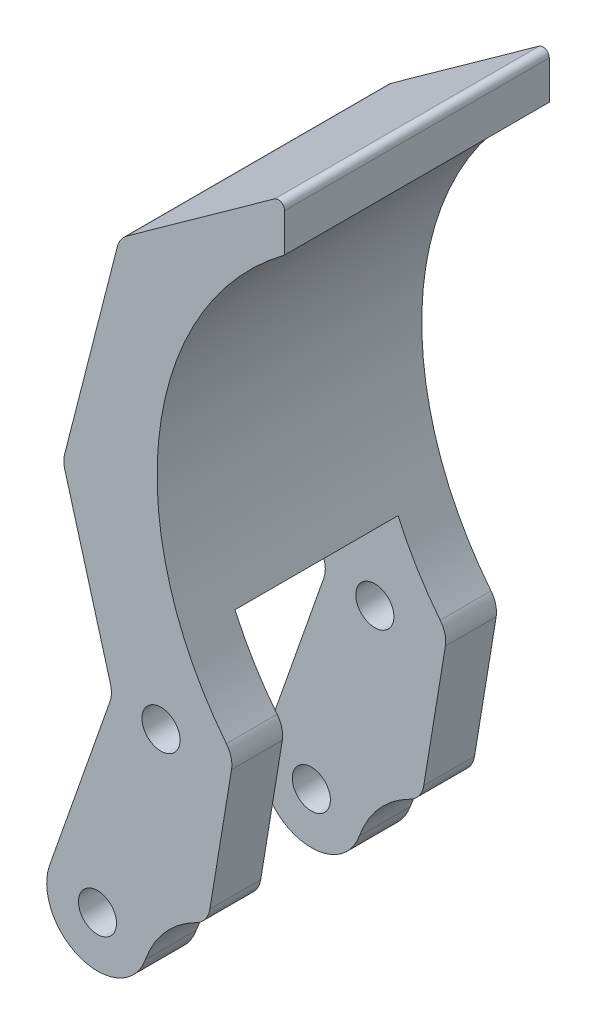
ISO-10303-21;
HEADER;
FILE_DESCRIPTION(('STEP AP214'),'2;1');
FILE_NAME('part.step','',(''),(''),'','','');
FILE_SCHEMA(('AUTOMOTIVE_DESIGN { 1 0 10303 214 1 1 1 1 }'));
ENDSEC;
DATA;
#1=APPLICATION_CONTEXT('core data for automotive mechanical design processes');
#2=APPLICATION_PROTOCOL_DEFINITION('international standard','automotive_design',2000,#1);
#3=PRODUCT_CONTEXT('',#1,'mechanical');
#4=PRODUCT('Part','Part','',(#3));
#5=PRODUCT_RELATED_PRODUCT_CATEGORY('part','',(#4));
#6=PRODUCT_DEFINITION_FORMATION('','',#4);
#7=PRODUCT_DEFINITION_CONTEXT('part definition',#1,'design');
#8=PRODUCT_DEFINITION('design','',#6,#7);
#9=PRODUCT_DEFINITION_SHAPE('','',#8);
#10=(LENGTH_UNIT() NAMED_UNIT(*) SI_UNIT(.MILLI.,.METRE.));
#11=(NAMED_UNIT(*) PLANE_ANGLE_UNIT() SI_UNIT($,.RADIAN.));
#12=(NAMED_UNIT(*) SI_UNIT($,.STERADIAN.) SOLID_ANGLE_UNIT());
#13=UNCERTAINTY_MEASURE_WITH_UNIT(LENGTH_MEASURE(1.E-05),#10,'distance_accuracy_value','');
#14=(GEOMETRIC_REPRESENTATION_CONTEXT(3) GLOBAL_UNCERTAINTY_ASSIGNED_CONTEXT((#13)) GLOBAL_UNIT_ASSIGNED_CONTEXT((#10,
#11,#12)) REPRESENTATION_CONTEXT('',''));
#15=CARTESIAN_POINT('',(0.,0.,0.));
#16=DIRECTION('',(0.,0.,1.));
#17=DIRECTION('',(1.,0.,0.));
#18=AXIS2_PLACEMENT_3D('',#15,#16,#17);
#19=CARTESIAN_POINT('',(-26.7730991458901,38.7518293933664,20.84));
#20=DIRECTION('',(-0.269912854825617,0.962884754682452,0.));
#21=DIRECTION('',(-0.962884754682452,-0.269912854825617,0.));
#22=AXIS2_PLACEMENT_3D('',#19,#20,#21);
#23=PLANE('',#22);
#24=DIRECTION('',(-0.962884754682452,-0.269912854825617,0.));
#25=VECTOR('',#24,1.);
#26=CARTESIAN_POINT('',(-19.8345750781231,40.6968148449482,16.84));
#27=LINE('',#26,#25);
#28=CARTESIAN_POINT('',(-19.8345750781231,40.6968148449482,16.84));
#29=VERTEX_POINT('',#28);
#30=CARTESIAN_POINT('',(-26.7730991458901,38.7518293933664,16.84));
#31=VERTEX_POINT('',#30);
#32=EDGE_CURVE('E211',#29,#31,#27,.T.);
#33=ORIENTED_EDGE('',*,*,#32,.T.);
#34=DIRECTION('',(0.,0.,-1.));
#35=VECTOR('',#34,1.);
#36=CARTESIAN_POINT('',(-26.7730991458901,38.7518293933664,20.84));
#37=LINE('',#36,#35);
#38=CARTESIAN_POINT('',(-26.7730991458901,38.7518293933664,4.));
#39=VERTEX_POINT('',#38);
#40=EDGE_CURVE('E64',#31,#39,#37,.T.);
#41=ORIENTED_EDGE('',*,*,#40,.T.);
#42=DIRECTION('',(0.962884754682452,0.269912854825617,0.));
#43=VECTOR('',#42,1.);
#44=CARTESIAN_POINT('',(3.99148156645819,47.3756608199233,4.));
#45=LINE('',#44,#43);
#46=CARTESIAN_POINT('',(-19.8345750781231,40.6968148449482,4.));
#47=VERTEX_POINT('',#46);
#48=EDGE_CURVE('E224',#39,#47,#45,.T.);
#49=ORIENTED_EDGE('',*,*,#48,.T.);
#50=DIRECTION('',(0.,0.,-1.));
#51=VECTOR('',#50,1.);
#52=CARTESIAN_POINT('',(-19.8345750781231,40.6968148449482,20.84));
#53=LINE('',#52,#51);
#54=EDGE_CURVE('E56',#29,#47,#53,.T.);
#55=ORIENTED_EDGE('',*,*,#54,.F.);
#56=EDGE_LOOP('',(#33,#41,#49,#55));
#57=FACE_BOUND('',#56,.T.);
#58=ADVANCED_FACE('F39',(#57),#23,.F.);
#59=CARTESIAN_POINT('',(3.02913563456561,50.8087252701093,4.));
#60=DIRECTION('',(0.,0.,-1.));
#61=DIRECTION('',(-1.,0.,0.));
#62=AXIS2_PLACEMENT_3D('',#59,#60,#61);
#63=PLANE('',#62);
#64=CARTESIAN_POINT('',(-21.6661944751087,33.6343221426984,4.));
#65=DIRECTION('',(0.,0.,1.));
#66=DIRECTION('',(1.,0.,0.));
#67=AXIS2_PLACEMENT_3D('',#64,#65,#66);
#68=CIRCLE('',#67,1.5);
#69=CARTESIAN_POINT('',(-20.1661944751087,33.6343221426984,4.));
#70=VERTEX_POINT('',#69);
#71=EDGE_CURVE('E235',#70,#70,#68,.T.);
#72=ORIENTED_EDGE('',*,*,#71,.F.);
#73=EDGE_LOOP('',(#72));
#74=FACE_BOUND('',#73,.T.);
#75=CARTESIAN_POINT('',(-26.6661944751087,18.6343221426984,4.));
#76=DIRECTION('',(0.,0.,1.));
#77=DIRECTION('',(-1.,0.,0.));
#78=AXIS2_PLACEMENT_3D('',#75,#76,#77);
#79=CIRCLE('',#78,1.5);
#80=CARTESIAN_POINT('',(-28.1661944751087,18.6343221426984,4.));
#81=VERTEX_POINT('',#80);
#82=EDGE_CURVE('E241',#81,#81,#79,.T.);
#83=ORIENTED_EDGE('',*,*,#82,.F.);
#84=EDGE_LOOP('',(#83));
#85=FACE_BOUND('',#84,.T.);
#86=ORIENTED_EDGE('',*,*,#48,.F.);
#87=DIRECTION('',(0.269912854825616,-0.962884754682452,0.));
#88=VECTOR('',#87,1.);
#89=CARTESIAN_POINT('',(-25.6428361003143,34.7197389022744,4.));
#90=LINE('',#89,#88);
#91=CARTESIAN_POINT('',(-25.6428361003143,34.7197389022744,4.));
#92=VERTEX_POINT('',#91);
#93=EDGE_CURVE('E249',#39,#92,#90,.T.);
#94=ORIENTED_EDGE('',*,*,#93,.T.);
#95=CARTESIAN_POINT('',(-27.5686056096793,34.1799131926231,4.));
#96=DIRECTION('',(0.,0.,-1.));
#97=DIRECTION('',(1.,0.,0.));
#98=AXIS2_PLACEMENT_3D('',#95,#96,#97);
#99=CIRCLE('',#98,2.);
#100=CARTESIAN_POINT('',(-25.6814762724612,33.5175365138287,4.));
#101=VERTEX_POINT('',#100);
#102=EDGE_CURVE('E252',#92,#101,#99,.T.);
#103=ORIENTED_EDGE('',*,*,#102,.T.);
#104=DIRECTION('',(-0.331188339397233,-0.943564668609048,0.));
#105=VECTOR('',#104,1.);
#106=CARTESIAN_POINT('',(-30.4404547988141,19.9590760791758,4.));
#107=LINE('',#106,#105);
#108=CARTESIAN_POINT('',(-30.4404547988141,19.9590760791758,4.));
#109=VERTEX_POINT('',#108);
#110=EDGE_CURVE('E254',#101,#109,#107,.T.);
#111=ORIENTED_EDGE('',*,*,#110,.T.);
#112=CARTESIAN_POINT('',(-26.6661944751087,18.6343221426984,4.));
#113=DIRECTION('',(0.,0.,1.));
#114=DIRECTION('',(1.,0.,0.));
#115=AXIS2_PLACEMENT_3D('',#112,#113,#114);
#116=CIRCLE('',#115,4.00000174791326);
#117=CARTESIAN_POINT('',(-22.8919341514033,17.309568206221,4.));
#118=VERTEX_POINT('',#117);
#119=EDGE_CURVE('E256',#109,#118,#116,.T.);
#120=ORIENTED_EDGE('',*,*,#119,.T.);
#121=CARTESIAN_POINT('',(-15.3434168025309,14.6600614910431,4.));
#122=DIRECTION('',(0.,0.,-1.));
#123=DIRECTION('',(-1.,0.,0.));
#124=AXIS2_PLACEMENT_3D('',#121,#122,#123);
#125=CIRCLE('',#124,8.);
#126=CARTESIAN_POINT('',(-18.8990856555673,21.8264566104561,4.));
#127=VERTEX_POINT('',#126);
#128=EDGE_CURVE('E258',#118,#127,#125,.T.);
#129=ORIENTED_EDGE('',*,*,#128,.T.);
#130=CARTESIAN_POINT('',(-19.7880028688264,23.6180553903094,4.));
#131=DIRECTION('',(0.,0.,1.));
#132=DIRECTION('',(1.,0.,0.));
#133=AXIS2_PLACEMENT_3D('',#130,#131,#132);
#134=CIRCLE('',#133,2.);
#135=CARTESIAN_POINT('',(-17.8145227633955,23.2934382720478,4.));
#136=VERTEX_POINT('',#135);
#137=EDGE_CURVE('E260',#127,#136,#134,.T.);
#138=ORIENTED_EDGE('',*,*,#137,.T.);
#139=DIRECTION('',(0.162308559130773,0.986740052715452,0.));
#140=VECTOR('',#139,1.);
#141=CARTESIAN_POINT('',(-16.1102828925224,33.65420882556,4.));
#142=LINE('',#141,#140);
#143=CARTESIAN_POINT('',(-16.1102828925224,33.65420882556,4.));
#144=VERTEX_POINT('',#143);
#145=EDGE_CURVE('E262',#136,#144,#142,.T.);
#146=ORIENTED_EDGE('',*,*,#145,.T.);
#147=CARTESIAN_POINT('',(-18.0837629979533,33.9788259438216,4.));
#148=DIRECTION('',(0.,0.,1.));
#149=DIRECTION('',(1.,0.,0.));
#150=AXIS2_PLACEMENT_3D('',#147,#148,#149);
#151=CIRCLE('',#150,2.);
#152=CARTESIAN_POINT('',(-16.5198445807297,35.2254851531762,4.));
#153=VERTEX_POINT('',#152);
#154=EDGE_CURVE('E264',#144,#153,#151,.T.);
#155=ORIENTED_EDGE('',*,*,#154,.T.);
#156=CARTESIAN_POINT('',(3.02913563456561,50.8087252701093,4.));
#157=DIRECTION('',(0.,0.,-1.));
#158=DIRECTION('',(-1.,0.,0.));
#159=AXIS2_PLACEMENT_3D('',#156,#157,#158);
#160=CIRCLE('',#159,25.);
#161=EDGE_CURVE('E247',#153,#47,#160,.T.);
#162=ORIENTED_EDGE('',*,*,#161,.T.);
#163=EDGE_LOOP('',(#86,#94,#103,#111,#120,#129,#138,#146,#155,#162));
#164=FACE_BOUND('',#163,.T.);
#165=ADVANCED_FACE('F454',(#74,#85,#164),#63,.F.);
#166=CARTESIAN_POINT('',(3.02913563456561,50.8087252701093,0.));
#167=DIRECTION('',(0.,0.,-1.));
#168=DIRECTION('',(-1.,0.,0.));
#169=AXIS2_PLACEMENT_3D('',#166,#167,#168);
#170=PLANE('',#169);
#171=DIRECTION('',(0.,1.,0.));
#172=VECTOR('',#171,1.);
#173=CARTESIAN_POINT('',(-11.927927268659,73.8667263637474,0.));
#174=LINE('',#173,#172);
#175=CARTESIAN_POINT('',(-11.927927268659,70.8408561929288,0.));
#176=VERTEX_POINT('',#175);
#177=CARTESIAN_POINT('',(-11.927927268659,73.8667263637474,0.));
#178=VERTEX_POINT('',#177);
#179=EDGE_CURVE('E268',#176,#178,#174,.T.);
#180=ORIENTED_EDGE('',*,*,#179,.F.);
#181=CARTESIAN_POINT('',(3.02913563456561,50.8087252701093,0.));
#182=DIRECTION('',(0.,0.,-1.));
#183=DIRECTION('',(-1.,0.,0.));
#184=AXIS2_PLACEMENT_3D('',#181,#182,#183);
#185=CIRCLE('',#184,25.);
#186=CARTESIAN_POINT('',(-16.5198445807297,35.2254851531762,0.));
#187=VERTEX_POINT('',#186);
#188=EDGE_CURVE('E244',#187,#176,#185,.T.);
#189=ORIENTED_EDGE('',*,*,#188,.F.);
#190=CARTESIAN_POINT('',(-18.0837629979533,33.9788259438216,0.));
#191=DIRECTION('',(0.,0.,1.));
#192=DIRECTION('',(1.,0.,0.));
#193=AXIS2_PLACEMENT_3D('',#190,#191,#192);
#194=CIRCLE('',#193,2.);
#195=CARTESIAN_POINT('',(-16.1102828925224,33.65420882556,0.));
#196=VERTEX_POINT('',#195);
#197=EDGE_CURVE('E250',#196,#187,#194,.T.);
#198=ORIENTED_EDGE('',*,*,#197,.F.);
#199=DIRECTION('',(0.162308559130773,0.986740052715452,0.));
#200=VECTOR('',#199,1.);
#201=CARTESIAN_POINT('',(-16.1102828925224,33.65420882556,0.));
#202=LINE('',#201,#200);
#203=CARTESIAN_POINT('',(-17.8145227633955,23.2934382720478,0.));
#204=VERTEX_POINT('',#203);
#205=EDGE_CURVE('E292',#204,#196,#202,.T.);
#206=ORIENTED_EDGE('',*,*,#205,.F.);
#207=CARTESIAN_POINT('',(-19.7880028688264,23.6180553903094,0.));
#208=DIRECTION('',(0.,0.,1.));
#209=DIRECTION('',(1.,0.,0.));
#210=AXIS2_PLACEMENT_3D('',#207,#208,#209);
#211=CIRCLE('',#210,2.);
#212=CARTESIAN_POINT('',(-18.8990856555673,21.8264566104561,0.));
#213=VERTEX_POINT('',#212);
#214=EDGE_CURVE('E290',#213,#204,#211,.T.);
#215=ORIENTED_EDGE('',*,*,#214,.F.);
#216=CARTESIAN_POINT('',(-15.3434168025309,14.6600614910431,0.));
#217=DIRECTION('',(0.,0.,-1.));
#218=DIRECTION('',(-1.,0.,0.));
#219=AXIS2_PLACEMENT_3D('',#216,#217,#218);
#220=CIRCLE('',#219,8.);
#221=CARTESIAN_POINT('',(-22.8919341514033,17.309568206221,0.));
#222=VERTEX_POINT('',#221);
#223=EDGE_CURVE('E288',#222,#213,#220,.T.);
#224=ORIENTED_EDGE('',*,*,#223,.F.);
#225=CARTESIAN_POINT('',(-26.6661944751087,18.6343221426984,0.));
#226=DIRECTION('',(0.,0.,1.));
#227=DIRECTION('',(1.,0.,0.));
#228=AXIS2_PLACEMENT_3D('',#225,#226,#227);
#229=CIRCLE('',#228,4.00000174791326);
#230=CARTESIAN_POINT('',(-30.4404547988141,19.9590760791758,0.));
#231=VERTEX_POINT('',#230);
#232=EDGE_CURVE('E286',#231,#222,#229,.T.);
#233=ORIENTED_EDGE('',*,*,#232,.F.);
#234=DIRECTION('',(-0.331188339397233,-0.943564668609048,0.));
#235=VECTOR('',#234,1.);
#236=CARTESIAN_POINT('',(-30.4404547988141,19.9590760791758,0.));
#237=LINE('',#236,#235);
#238=CARTESIAN_POINT('',(-25.6814762724612,33.5175365138287,0.));
#239=VERTEX_POINT('',#238);
#240=EDGE_CURVE('E284',#239,#231,#237,.T.);
#241=ORIENTED_EDGE('',*,*,#240,.F.);
#242=CARTESIAN_POINT('',(-27.5686056096793,34.1799131926231,0.));
#243=DIRECTION('',(0.,0.,-1.));
#244=DIRECTION('',(1.,0.,0.));
#245=AXIS2_PLACEMENT_3D('',#242,#243,#244);
#246=CIRCLE('',#245,2.);
#247=CARTESIAN_POINT('',(-25.6428361003143,34.7197389022744,0.));
#248=VERTEX_POINT('',#247);
#249=EDGE_CURVE('E282',#248,#239,#246,.T.);
#250=ORIENTED_EDGE('',*,*,#249,.F.);
#251=DIRECTION('',(0.269912854825616,-0.962884754682452,0.));
#252=VECTOR('',#251,1.);
#253=CARTESIAN_POINT('',(-25.6428361003143,34.7197389022744,0.));
#254=LINE('',#253,#252);
#255=CARTESIAN_POINT('',(-29.2417202398724,47.5583666663643,0.));
#256=VERTEX_POINT('',#255);
#257=EDGE_CURVE('E280',#256,#248,#254,.T.);
#258=ORIENTED_EDGE('',*,*,#257,.F.);
#259=CARTESIAN_POINT('',(-27.3159507305075,48.0981923760155,0.));
#260=DIRECTION('',(0.,0.,1.));
#261=DIRECTION('',(-1.,0.,0.));
#262=AXIS2_PLACEMENT_3D('',#259,#260,#261);
#263=CIRCLE('',#262,2.);
#264=CARTESIAN_POINT('',(-29.2536289022766,48.5935743525241,0.));
#265=VERTEX_POINT('',#264);
#266=EDGE_CURVE('E278',#265,#256,#263,.T.);
#267=ORIENTED_EDGE('',*,*,#266,.F.);
#268=DIRECTION('',(-0.247690988254264,-0.968839085884558,0.));
#269=VECTOR('',#268,1.);
#270=CARTESIAN_POINT('',(-29.2536289022766,48.5935743525241,0.));
#271=LINE('',#270,#269);
#272=CARTESIAN_POINT('',(-25.1082326082913,64.8082214190178,0.));
#273=VERTEX_POINT('',#272);
#274=EDGE_CURVE('E276',#273,#265,#271,.T.);
#275=ORIENTED_EDGE('',*,*,#274,.F.);
#276=CARTESIAN_POINT('',(-23.1705544365222,64.3128394425093,0.));
#277=DIRECTION('',(0.,0.,1.));
#278=DIRECTION('',(-1.,0.,0.));
#279=AXIS2_PLACEMENT_3D('',#276,#277,#278);
#280=CIRCLE('',#279,2.);
#281=CARTESIAN_POINT('',(-24.3364766359972,65.9378395732082,0.));
#282=VERTEX_POINT('',#281);
#283=EDGE_CURVE('E274',#282,#273,#280,.T.);
#284=ORIENTED_EDGE('',*,*,#283,.F.);
#285=DIRECTION('',(-0.812500065349455,-0.58296109973748,0.));
#286=VECTOR('',#285,1.);
#287=CARTESIAN_POINT('',(-24.3364766359972,65.9378395732082,0.));
#288=LINE('',#287,#286);
#289=CARTESIAN_POINT('',(-12.7194078185277,74.2729763964221,0.));
#290=VERTEX_POINT('',#289);
#291=EDGE_CURVE('E272',#290,#282,#288,.T.);
#292=ORIENTED_EDGE('',*,*,#291,.F.);
#293=CARTESIAN_POINT('',(-12.427927268659,73.8667263637474,0.));
#294=DIRECTION('',(0.,0.,1.));
#295=DIRECTION('',(-1.,0.,0.));
#296=AXIS2_PLACEMENT_3D('',#293,#294,#295);
#297=CIRCLE('',#296,0.499999999999995);
#298=EDGE_CURVE('E270',#178,#290,#297,.T.);
#299=ORIENTED_EDGE('',*,*,#298,.F.);
#300=EDGE_LOOP('',(#180,#189,#198,#206,#215,#224,#233,#241,#250,#258,#267,#275,#284,#292,#299));
#301=FACE_BOUND('',#300,.T.);
#302=CARTESIAN_POINT('',(-26.6661944751087,18.6343221426984,0.));
#303=DIRECTION('',(0.,0.,1.));
#304=DIRECTION('',(-1.,0.,0.));
#305=AXIS2_PLACEMENT_3D('',#302,#303,#304);
#306=CIRCLE('',#305,1.5);
#307=CARTESIAN_POINT('',(-28.1661944751087,18.6343221426984,0.));
#308=VERTEX_POINT('',#307);
#309=EDGE_CURVE('E238',#308,#308,#306,.T.);
#310=ORIENTED_EDGE('',*,*,#309,.T.);
#311=EDGE_LOOP('',(#310));
#312=FACE_BOUND('',#311,.T.);
#313=CARTESIAN_POINT('',(-21.6661944751087,33.6343221426984,0.));
#314=DIRECTION('',(0.,0.,1.));
#315=DIRECTION('',(1.,0.,0.));
#316=AXIS2_PLACEMENT_3D('',#313,#314,#315);
#317=CIRCLE('',#316,1.5);
#318=CARTESIAN_POINT('',(-20.1661944751087,33.6343221426984,0.));
#319=VERTEX_POINT('',#318);
#320=EDGE_CURVE('E234',#319,#319,#317,.T.);
#321=ORIENTED_EDGE('',*,*,#320,.T.);
#322=EDGE_LOOP('',(#321));
#323=FACE_BOUND('',#322,.T.);
#324=ADVANCED_FACE('F439',(#301,#312,#323),#170,.T.);
#325=CARTESIAN_POINT('',(3.02913563456561,50.8087252701093,4.));
#326=DIRECTION('',(0.,0.,-1.));
#327=DIRECTION('',(-1.,0.,0.));
#328=AXIS2_PLACEMENT_3D('',#325,#326,#327);
#329=CYLINDRICAL_SURFACE('',#328,25.);
#330=DIRECTION('',(0.,0.,-1.));
#331=VECTOR('',#330,1.);
#332=CARTESIAN_POINT('',(-11.927927268659,70.8408561929288,4.));
#333=LINE('',#332,#331);
#334=CARTESIAN_POINT('',(-11.927927268659,70.8408561929288,20.84));
#335=VERTEX_POINT('',#334);
#336=EDGE_CURVE('E11',#335,#176,#333,.T.);
#337=ORIENTED_EDGE('',*,*,#336,.F.);
#338=CARTESIAN_POINT('',(3.02913563456561,50.8087252701093,20.84));
#339=DIRECTION('',(0.,0.,-1.));
#340=DIRECTION('',(1.,0.,0.));
#341=AXIS2_PLACEMENT_3D('',#338,#339,#340);
#342=CIRCLE('',#341,25.);
#343=CARTESIAN_POINT('',(-16.5198445807297,35.2254851531762,20.84));
#344=VERTEX_POINT('',#343);
#345=EDGE_CURVE('E407',#344,#335,#342,.T.);
#346=ORIENTED_EDGE('',*,*,#345,.F.);
#347=DIRECTION('',(0.,0.,1.));
#348=VECTOR('',#347,1.);
#349=CARTESIAN_POINT('',(-16.5198445807297,35.2254851531762,16.84));
#350=LINE('',#349,#348);
#351=CARTESIAN_POINT('',(-16.5198445807297,35.2254851531762,16.84));
#352=VERTEX_POINT('',#351);
#353=EDGE_CURVE('E221',#352,#344,#350,.T.);
#354=ORIENTED_EDGE('',*,*,#353,.F.);
#355=CARTESIAN_POINT('',(3.02913563456561,50.8087252701093,16.84));
#356=DIRECTION('',(0.,0.,-1.));
#357=DIRECTION('',(1.,0.,0.));
#358=AXIS2_PLACEMENT_3D('',#355,#356,#357);
#359=CIRCLE('',#358,25.);
#360=EDGE_CURVE('E214',#352,#29,#359,.T.);
#361=ORIENTED_EDGE('',*,*,#360,.T.);
#362=ORIENTED_EDGE('',*,*,#54,.T.);
#363=ORIENTED_EDGE('',*,*,#161,.F.);
#364=DIRECTION('',(0.,0.,-1.));
#365=VECTOR('',#364,1.);
#366=CARTESIAN_POINT('',(-16.5198445807297,35.2254851531762,4.));
#367=LINE('',#366,#365);
#368=EDGE_CURVE('E266',#153,#187,#367,.T.);
#369=ORIENTED_EDGE('',*,*,#368,.T.);
#370=ORIENTED_EDGE('',*,*,#188,.T.);
#371=EDGE_LOOP('',(#337,#346,#354,#361,#362,#363,#369,#370));
#372=FACE_BOUND('',#371,.T.);
#373=ADVANCED_FACE('F41',(#372),#329,.F.);
#374=CARTESIAN_POINT('',(-11.927927268659,73.8667263637474,4.));
#375=DIRECTION('',(-1.,0.,0.));
#376=DIRECTION('',(0.,0.,1.));
#377=AXIS2_PLACEMENT_3D('',#374,#375,#376);
#378=PLANE('',#377);
#379=ORIENTED_EDGE('',*,*,#179,.T.);
#380=DIRECTION('',(0.,0.,-1.));
#381=VECTOR('',#380,1.);
#382=CARTESIAN_POINT('',(-11.927927268659,73.8667263637474,4.));
#383=LINE('',#382,#381);
#384=CARTESIAN_POINT('',(-11.927927268659,73.8667263637474,20.84));
#385=VERTEX_POINT('',#384);
#386=EDGE_CURVE('E48',#385,#178,#383,.T.);
#387=ORIENTED_EDGE('',*,*,#386,.F.);
#388=DIRECTION('',(0.,1.,0.));
#389=VECTOR('',#388,1.);
#390=CARTESIAN_POINT('',(-11.927927268659,70.8408561929288,20.84));
#391=LINE('',#390,#389);
#392=EDGE_CURVE('E410',#335,#385,#391,.T.);
#393=ORIENTED_EDGE('',*,*,#392,.F.);
#394=ORIENTED_EDGE('',*,*,#336,.T.);
#395=EDGE_LOOP('',(#379,#387,#393,#394));
#396=FACE_BOUND('',#395,.T.);
#397=ADVANCED_FACE('F486',(#396),#378,.F.);
#398=CARTESIAN_POINT('',(-12.427927268659,73.8667263637474,4.));
#399=DIRECTION('',(0.,0.,-1.));
#400=DIRECTION('',(-1.,0.,0.));
#401=AXIS2_PLACEMENT_3D('',#398,#399,#400);
#402=CYLINDRICAL_SURFACE('',#401,0.499999999999995);
#403=ORIENTED_EDGE('',*,*,#298,.T.);
#404=DIRECTION('',(0.,0.,-1.));
#405=VECTOR('',#404,1.);
#406=CARTESIAN_POINT('',(-12.7194078185277,74.2729763964221,4.));
#407=LINE('',#406,#405);
#408=CARTESIAN_POINT('',(-12.7194078185277,74.2729763964221,20.84));
#409=VERTEX_POINT('',#408);
#410=EDGE_CURVE('E330',#409,#290,#407,.T.);
#411=ORIENTED_EDGE('',*,*,#410,.F.);
#412=CARTESIAN_POINT('',(-12.427927268659,73.8667263637474,20.84));
#413=DIRECTION('',(0.,0.,1.));
#414=DIRECTION('',(1.,0.,0.));
#415=AXIS2_PLACEMENT_3D('',#412,#413,#414);
#416=CIRCLE('',#415,0.499999999999995);
#417=EDGE_CURVE('E413',#385,#409,#416,.T.);
#418=ORIENTED_EDGE('',*,*,#417,.F.);
#419=ORIENTED_EDGE('',*,*,#386,.T.);
#420=EDGE_LOOP('',(#403,#411,#418,#419));
#421=FACE_BOUND('',#420,.T.);
#422=ADVANCED_FACE('F489',(#421),#402,.T.);
#423=CARTESIAN_POINT('',(-24.3364766359972,65.9378395732082,4.));
#424=DIRECTION('',(0.58296109973748,-0.812500065349455,0.));
#425=DIRECTION('',(0.812500065349455,0.58296109973748,0.));
#426=AXIS2_PLACEMENT_3D('',#423,#424,#425);
#427=PLANE('',#426);
#428=ORIENTED_EDGE('',*,*,#291,.T.);
#429=DIRECTION('',(0.,0.,-1.));
#430=VECTOR('',#429,1.);
#431=CARTESIAN_POINT('',(-24.3364766359972,65.9378395732082,4.));
#432=LINE('',#431,#430);
#433=CARTESIAN_POINT('',(-24.3364766359972,65.9378395732082,20.84));
#434=VERTEX_POINT('',#433);
#435=EDGE_CURVE('E327',#434,#282,#432,.T.);
#436=ORIENTED_EDGE('',*,*,#435,.F.);
#437=DIRECTION('',(-0.812500065349455,-0.58296109973748,0.));
#438=VECTOR('',#437,1.);
#439=CARTESIAN_POINT('',(-12.7194078185277,74.2729763964221,20.84));
#440=LINE('',#439,#438);
#441=EDGE_CURVE('E416',#409,#434,#440,.T.);
#442=ORIENTED_EDGE('',*,*,#441,.F.);
#443=ORIENTED_EDGE('',*,*,#410,.T.);
#444=EDGE_LOOP('',(#428,#436,#442,#443));
#445=FACE_BOUND('',#444,.T.);
#446=ADVANCED_FACE('F494',(#445),#427,.F.);
#447=CARTESIAN_POINT('',(-23.1705544365222,64.3128394425093,4.));
#448=DIRECTION('',(0.,0.,-1.));
#449=DIRECTION('',(-1.,0.,0.));
#450=AXIS2_PLACEMENT_3D('',#447,#448,#449);
#451=CYLINDRICAL_SURFACE('',#450,2.);
#452=ORIENTED_EDGE('',*,*,#283,.T.);
#453=DIRECTION('',(0.,0.,-1.));
#454=VECTOR('',#453,1.);
#455=CARTESIAN_POINT('',(-25.1082326082913,64.8082214190178,4.));
#456=LINE('',#455,#454);
#457=CARTESIAN_POINT('',(-25.1082326082913,64.8082214190178,20.84));
#458=VERTEX_POINT('',#457);
#459=EDGE_CURVE('E324',#458,#273,#456,.T.);
#460=ORIENTED_EDGE('',*,*,#459,.F.);
#461=CARTESIAN_POINT('',(-23.1705544365222,64.3128394425093,20.84));
#462=DIRECTION('',(0.,0.,1.));
#463=DIRECTION('',(1.,0.,0.));
#464=AXIS2_PLACEMENT_3D('',#461,#462,#463);
#465=CIRCLE('',#464,2.);
#466=EDGE_CURVE('E419',#434,#458,#465,.T.);
#467=ORIENTED_EDGE('',*,*,#466,.F.);
#468=ORIENTED_EDGE('',*,*,#435,.T.);
#469=EDGE_LOOP('',(#452,#460,#467,#468));
#470=FACE_BOUND('',#469,.T.);
#471=ADVANCED_FACE('F497',(#470),#451,.T.);
#472=CARTESIAN_POINT('',(-29.2536289022766,48.5935743525241,4.));
#473=DIRECTION('',(0.968839085884558,-0.247690988254264,0.));
#474=DIRECTION('',(0.247690988254264,0.968839085884558,0.));
#475=AXIS2_PLACEMENT_3D('',#472,#473,#474);
#476=PLANE('',#475);
#477=ORIENTED_EDGE('',*,*,#274,.T.);
#478=DIRECTION('',(0.,0.,-1.));
#479=VECTOR('',#478,1.);
#480=CARTESIAN_POINT('',(-29.2536289022766,48.5935743525241,4.));
#481=LINE('',#480,#479);
#482=CARTESIAN_POINT('',(-29.2536289022766,48.5935743525241,20.84));
#483=VERTEX_POINT('',#482);
#484=EDGE_CURVE('E321',#483,#265,#481,.T.);
#485=ORIENTED_EDGE('',*,*,#484,.F.);
#486=DIRECTION('',(-0.247690988254264,-0.968839085884558,0.));
#487=VECTOR('',#486,1.);
#488=CARTESIAN_POINT('',(-25.1082326082913,64.8082214190178,20.84));
#489=LINE('',#488,#487);
#490=EDGE_CURVE('E229',#458,#483,#489,.T.);
#491=ORIENTED_EDGE('',*,*,#490,.F.);
#492=ORIENTED_EDGE('',*,*,#459,.T.);
#493=EDGE_LOOP('',(#477,#485,#491,#492));
#494=FACE_BOUND('',#493,.T.);
#495=ADVANCED_FACE('F498',(#494),#476,.F.);
#496=CARTESIAN_POINT('',(-27.3159507305075,48.0981923760155,4.));
#497=DIRECTION('',(0.,0.,-1.));
#498=DIRECTION('',(-1.,0.,0.));
#499=AXIS2_PLACEMENT_3D('',#496,#497,#498);
#500=CYLINDRICAL_SURFACE('',#499,2.);
#501=ORIENTED_EDGE('',*,*,#266,.T.);
#502=DIRECTION('',(0.,0.,-1.));
#503=VECTOR('',#502,1.);
#504=CARTESIAN_POINT('',(-29.2417202398724,47.5583666663643,4.));
#505=LINE('',#504,#503);
#506=CARTESIAN_POINT('',(-29.2417202398724,47.5583666663643,20.84));
#507=VERTEX_POINT('',#506);
#508=EDGE_CURVE('E318',#507,#256,#505,.T.);
#509=ORIENTED_EDGE('',*,*,#508,.F.);
#510=CARTESIAN_POINT('',(-27.3159507305075,48.0981923760155,20.84));
#511=DIRECTION('',(0.,0.,1.));
#512=DIRECTION('',(1.,0.,0.));
#513=AXIS2_PLACEMENT_3D('',#510,#511,#512);
#514=CIRCLE('',#513,2.);
#515=EDGE_CURVE('E225',#483,#507,#514,.T.);
#516=ORIENTED_EDGE('',*,*,#515,.F.);
#517=ORIENTED_EDGE('',*,*,#484,.T.);
#518=EDGE_LOOP('',(#501,#509,#516,#517));
#519=FACE_BOUND('',#518,.T.);
#520=ADVANCED_FACE('F430',(#519),#500,.T.);
#521=CARTESIAN_POINT('',(-25.6428361003143,34.7197389022744,4.));
#522=DIRECTION('',(0.962884754682452,0.269912854825616,0.));
#523=DIRECTION('',(-0.269912854825616,0.962884754682452,0.));
#524=AXIS2_PLACEMENT_3D('',#521,#522,#523);
#525=PLANE('',#524);
#526=ORIENTED_EDGE('',*,*,#257,.T.);
#527=DIRECTION('',(0.,0.,-1.));
#528=VECTOR('',#527,1.);
#529=CARTESIAN_POINT('',(-25.6428361003143,34.7197389022744,4.));
#530=LINE('',#529,#528);
#531=EDGE_CURVE('E315',#92,#248,#530,.T.);
#532=ORIENTED_EDGE('',*,*,#531,.F.);
#533=ORIENTED_EDGE('',*,*,#93,.F.);
#534=ORIENTED_EDGE('',*,*,#40,.F.);
#535=DIRECTION('',(0.269912854825616,-0.962884754682452,0.));
#536=VECTOR('',#535,1.);
#537=CARTESIAN_POINT('',(-26.7730991458901,38.7518293933664,16.84));
#538=LINE('',#537,#536);
#539=CARTESIAN_POINT('',(-25.6428361003143,34.7197389022744,16.84));
#540=VERTEX_POINT('',#539);
#541=EDGE_CURVE('E218',#31,#540,#538,.T.);
#542=ORIENTED_EDGE('',*,*,#541,.T.);
#543=DIRECTION('',(0.,0.,1.));
#544=VECTOR('',#543,1.);
#545=CARTESIAN_POINT('',(-25.6428361003143,34.7197389022744,16.84));
#546=LINE('',#545,#544);
#547=CARTESIAN_POINT('',(-25.6428361003143,34.7197389022744,20.84));
#548=VERTEX_POINT('',#547);
#549=EDGE_CURVE('E370',#540,#548,#546,.T.);
#550=ORIENTED_EDGE('',*,*,#549,.T.);
#551=DIRECTION('',(0.269912854825616,-0.962884754682452,0.));
#552=VECTOR('',#551,1.);
#553=CARTESIAN_POINT('',(-29.2417202398724,47.5583666663643,20.84));
#554=LINE('',#553,#552);
#555=EDGE_CURVE('E391',#507,#548,#554,.T.);
#556=ORIENTED_EDGE('',*,*,#555,.F.);
#557=ORIENTED_EDGE('',*,*,#508,.T.);
#558=EDGE_LOOP('',(#526,#532,#533,#534,#542,#550,#556,#557));
#559=FACE_BOUND('',#558,.T.);
#560=ADVANCED_FACE('F434',(#559),#525,.F.);
#561=CARTESIAN_POINT('',(-27.5686056096793,34.1799131926231,4.));
#562=DIRECTION('',(0.,0.,-1.));
#563=DIRECTION('',(-1.,0.,0.));
#564=AXIS2_PLACEMENT_3D('',#561,#562,#563);
#565=CYLINDRICAL_SURFACE('',#564,2.);
#566=ORIENTED_EDGE('',*,*,#249,.T.);
#567=DIRECTION('',(0.,0.,-1.));
#568=VECTOR('',#567,1.);
#569=CARTESIAN_POINT('',(-25.6814762724612,33.5175365138287,4.));
#570=LINE('',#569,#568);
#571=EDGE_CURVE('E312',#101,#239,#570,.T.);
#572=ORIENTED_EDGE('',*,*,#571,.F.);
#573=ORIENTED_EDGE('',*,*,#102,.F.);
#574=ORIENTED_EDGE('',*,*,#531,.T.);
#575=EDGE_LOOP('',(#566,#572,#573,#574));
#576=FACE_BOUND('',#575,.T.);
#577=ADVANCED_FACE('F446',(#576),#565,.F.);
#578=CARTESIAN_POINT('',(-30.4404547988141,19.9590760791758,4.));
#579=DIRECTION('',(0.943564668609048,-0.331188339397233,0.));
#580=DIRECTION('',(0.331188339397233,0.943564668609048,0.));
#581=AXIS2_PLACEMENT_3D('',#578,#579,#580);
#582=PLANE('',#581);
#583=ORIENTED_EDGE('',*,*,#240,.T.);
#584=DIRECTION('',(0.,0.,-1.));
#585=VECTOR('',#584,1.);
#586=CARTESIAN_POINT('',(-30.4404547988141,19.9590760791758,4.));
#587=LINE('',#586,#585);
#588=EDGE_CURVE('E309',#109,#231,#587,.T.);
#589=ORIENTED_EDGE('',*,*,#588,.F.);
#590=ORIENTED_EDGE('',*,*,#110,.F.);
#591=ORIENTED_EDGE('',*,*,#571,.T.);
#592=EDGE_LOOP('',(#583,#589,#590,#591));
#593=FACE_BOUND('',#592,.T.);
#594=ADVANCED_FACE('F450',(#593),#582,.F.);
#595=CARTESIAN_POINT('',(-26.6661944751087,18.6343221426984,4.));
#596=DIRECTION('',(0.,0.,-1.));
#597=DIRECTION('',(-1.,0.,0.));
#598=AXIS2_PLACEMENT_3D('',#595,#596,#597);
#599=CYLINDRICAL_SURFACE('',#598,4.00000174791326);
#600=ORIENTED_EDGE('',*,*,#232,.T.);
#601=DIRECTION('',(0.,0.,-1.));
#602=VECTOR('',#601,1.);
#603=CARTESIAN_POINT('',(-22.8919341514033,17.309568206221,4.));
#604=LINE('',#603,#602);
#605=EDGE_CURVE('E306',#118,#222,#604,.T.);
#606=ORIENTED_EDGE('',*,*,#605,.F.);
#607=ORIENTED_EDGE('',*,*,#119,.F.);
#608=ORIENTED_EDGE('',*,*,#588,.T.);
#609=EDGE_LOOP('',(#600,#606,#607,#608));
#610=FACE_BOUND('',#609,.T.);
#611=ADVANCED_FACE('F542',(#610),#599,.T.);
#612=CARTESIAN_POINT('',(-15.3434168025309,14.6600614910431,4.));
#613=DIRECTION('',(0.,0.,-1.));
#614=DIRECTION('',(-1.,0.,0.));
#615=AXIS2_PLACEMENT_3D('',#612,#613,#614);
#616=CYLINDRICAL_SURFACE('',#615,8.);
#617=ORIENTED_EDGE('',*,*,#223,.T.);
#618=DIRECTION('',(0.,0.,-1.));
#619=VECTOR('',#618,1.);
#620=CARTESIAN_POINT('',(-18.8990856555673,21.8264566104561,4.));
#621=LINE('',#620,#619);
#622=EDGE_CURVE('E303',#127,#213,#621,.T.);
#623=ORIENTED_EDGE('',*,*,#622,.F.);
#624=ORIENTED_EDGE('',*,*,#128,.F.);
#625=ORIENTED_EDGE('',*,*,#605,.T.);
#626=EDGE_LOOP('',(#617,#623,#624,#625));
#627=FACE_BOUND('',#626,.T.);
#628=ADVANCED_FACE('F538',(#627),#616,.F.);
#629=CARTESIAN_POINT('',(-19.7880028688264,23.6180553903094,4.));
#630=DIRECTION('',(0.,0.,-1.));
#631=DIRECTION('',(-1.,0.,0.));
#632=AXIS2_PLACEMENT_3D('',#629,#630,#631);
#633=CYLINDRICAL_SURFACE('',#632,2.);
#634=ORIENTED_EDGE('',*,*,#214,.T.);
#635=DIRECTION('',(0.,0.,-1.));
#636=VECTOR('',#635,1.);
#637=CARTESIAN_POINT('',(-17.8145227633955,23.2934382720478,4.));
#638=LINE('',#637,#636);
#639=EDGE_CURVE('E300',#136,#204,#638,.T.);
#640=ORIENTED_EDGE('',*,*,#639,.F.);
#641=ORIENTED_EDGE('',*,*,#137,.F.);
#642=ORIENTED_EDGE('',*,*,#622,.T.);
#643=EDGE_LOOP('',(#634,#640,#641,#642));
#644=FACE_BOUND('',#643,.T.);
#645=ADVANCED_FACE('F534',(#644),#633,.T.);
#646=CARTESIAN_POINT('',(-16.1102828925224,33.65420882556,4.));
#647=DIRECTION('',(-0.986740052715452,0.162308559130773,0.));
#648=DIRECTION('',(-0.162308559130773,-0.986740052715452,0.));
#649=AXIS2_PLACEMENT_3D('',#646,#647,#648);
#650=PLANE('',#649);
#651=ORIENTED_EDGE('',*,*,#205,.T.);
#652=DIRECTION('',(0.,0.,-1.));
#653=VECTOR('',#652,1.);
#654=CARTESIAN_POINT('',(-16.1102828925224,33.65420882556,4.));
#655=LINE('',#654,#653);
#656=EDGE_CURVE('E297',#144,#196,#655,.T.);
#657=ORIENTED_EDGE('',*,*,#656,.F.);
#658=ORIENTED_EDGE('',*,*,#145,.F.);
#659=ORIENTED_EDGE('',*,*,#639,.T.);
#660=EDGE_LOOP('',(#651,#657,#658,#659));
#661=FACE_BOUND('',#660,.T.);
#662=ADVANCED_FACE('F530',(#661),#650,.F.);
#663=CARTESIAN_POINT('',(-18.0837629979533,33.9788259438216,4.));
#664=DIRECTION('',(0.,0.,-1.));
#665=DIRECTION('',(-1.,0.,0.));
#666=AXIS2_PLACEMENT_3D('',#663,#664,#665);
#667=CYLINDRICAL_SURFACE('',#666,2.);
#668=ORIENTED_EDGE('',*,*,#197,.T.);
#669=ORIENTED_EDGE('',*,*,#368,.F.);
#670=ORIENTED_EDGE('',*,*,#154,.F.);
#671=ORIENTED_EDGE('',*,*,#656,.T.);
#672=EDGE_LOOP('',(#668,#669,#670,#671));
#673=FACE_BOUND('',#672,.T.);
#674=ADVANCED_FACE('F523',(#673),#667,.T.);
#675=CARTESIAN_POINT('',(-26.6661944751087,18.6343221426984,4.));
#676=DIRECTION('',(0.,0.,-1.));
#677=DIRECTION('',(-1.,0.,0.));
#678=AXIS2_PLACEMENT_3D('',#675,#676,#677);
#679=CYLINDRICAL_SURFACE('',#678,1.5);
#680=ORIENTED_EDGE('',*,*,#82,.T.);
#681=EDGE_LOOP('',(#680));
#682=FACE_BOUND('',#681,.T.);
#683=ORIENTED_EDGE('',*,*,#309,.F.);
#684=EDGE_LOOP('',(#683));
#685=FACE_BOUND('',#684,.T.);
#686=ADVANCED_FACE('F520',(#682,#685),#679,.F.);
#687=CARTESIAN_POINT('',(-21.6661944751087,33.6343221426984,4.));
#688=DIRECTION('',(0.,0.,-1.));
#689=DIRECTION('',(-1.,0.,0.));
#690=AXIS2_PLACEMENT_3D('',#687,#688,#689);
#691=CYLINDRICAL_SURFACE('',#690,1.5);
#692=ORIENTED_EDGE('',*,*,#71,.T.);
#693=EDGE_LOOP('',(#692));
#694=FACE_BOUND('',#693,.T.);
#695=ORIENTED_EDGE('',*,*,#320,.F.);
#696=EDGE_LOOP('',(#695));
#697=FACE_BOUND('',#696,.T.);
#698=ADVANCED_FACE('F517',(#694,#697),#691,.F.);
#699=CARTESIAN_POINT('',(3.02913563456561,50.8087252701093,20.84));
#700=DIRECTION('',(0.,0.,1.));
#701=DIRECTION('',(1.,0.,0.));
#702=AXIS2_PLACEMENT_3D('',#699,#700,#701);
#703=PLANE('',#702);
#704=CARTESIAN_POINT('',(-21.6661944751087,33.6343221426984,20.84));
#705=DIRECTION('',(0.,0.,-1.));
#706=DIRECTION('',(-1.,0.,0.));
#707=AXIS2_PLACEMENT_3D('',#704,#705,#706);
#708=CIRCLE('',#707,1.5);
#709=CARTESIAN_POINT('',(-23.1661944751087,33.6343221426984,20.84));
#710=VERTEX_POINT('',#709);
#711=EDGE_CURVE('E336',#710,#710,#708,.T.);
#712=ORIENTED_EDGE('',*,*,#711,.T.);
#713=EDGE_LOOP('',(#712));
#714=FACE_BOUND('',#713,.T.);
#715=CARTESIAN_POINT('',(-26.6661944751087,18.6343221426984,20.84));
#716=DIRECTION('',(0.,0.,-1.));
#717=DIRECTION('',(-1.,0.,0.));
#718=AXIS2_PLACEMENT_3D('',#715,#716,#717);
#719=CIRCLE('',#718,1.50000000000001);
#720=CARTESIAN_POINT('',(-28.1661944751087,18.6343221426984,20.84));
#721=VERTEX_POINT('',#720);
#722=EDGE_CURVE('E342',#721,#721,#719,.T.);
#723=ORIENTED_EDGE('',*,*,#722,.T.);
#724=EDGE_LOOP('',(#723));
#725=FACE_BOUND('',#724,.T.);
#726=ORIENTED_EDGE('',*,*,#555,.T.);
#727=CARTESIAN_POINT('',(-27.5686056096793,34.1799131926231,20.84));
#728=DIRECTION('',(0.,0.,-1.));
#729=DIRECTION('',(1.,0.,0.));
#730=AXIS2_PLACEMENT_3D('',#727,#728,#729);
#731=CIRCLE('',#730,2.);
#732=CARTESIAN_POINT('',(-25.6814762724612,33.5175365138287,20.84));
#733=VERTEX_POINT('',#732);
#734=EDGE_CURVE('E340',#548,#733,#731,.T.);
#735=ORIENTED_EDGE('',*,*,#734,.T.);
#736=DIRECTION('',(-0.331188339397234,-0.943564668609048,0.));
#737=VECTOR('',#736,1.);
#738=CARTESIAN_POINT('',(-25.6814762724612,33.5175365138287,20.84));
#739=LINE('',#738,#737);
#740=CARTESIAN_POINT('',(-30.4404547988141,19.9590760791758,20.84));
#741=VERTEX_POINT('',#740);
#742=EDGE_CURVE('E373',#733,#741,#739,.T.);
#743=ORIENTED_EDGE('',*,*,#742,.T.);
#744=CARTESIAN_POINT('',(-26.6661944751087,18.6343221426984,20.84));
#745=DIRECTION('',(0.,0.,1.));
#746=DIRECTION('',(1.,0.,0.));
#747=AXIS2_PLACEMENT_3D('',#744,#745,#746);
#748=CIRCLE('',#747,4.00000174791326);
#749=CARTESIAN_POINT('',(-22.8919341514033,17.309568206221,20.84));
#750=VERTEX_POINT('',#749);
#751=EDGE_CURVE('E376',#741,#750,#748,.T.);
#752=ORIENTED_EDGE('',*,*,#751,.T.);
#753=CARTESIAN_POINT('',(-15.3434168025309,14.6600614910431,20.84));
#754=DIRECTION('',(0.,0.,-1.));
#755=DIRECTION('',(1.,0.,0.));
#756=AXIS2_PLACEMENT_3D('',#753,#754,#755);
#757=CIRCLE('',#756,8.);
#758=CARTESIAN_POINT('',(-18.8990856555673,21.8264566104561,20.84));
#759=VERTEX_POINT('',#758);
#760=EDGE_CURVE('E379',#750,#759,#757,.T.);
#761=ORIENTED_EDGE('',*,*,#760,.T.);
#762=CARTESIAN_POINT('',(-19.7880028688264,23.6180553903094,20.84));
#763=DIRECTION('',(0.,0.,1.));
#764=DIRECTION('',(1.,0.,0.));
#765=AXIS2_PLACEMENT_3D('',#762,#763,#764);
#766=CIRCLE('',#765,2.);
#767=CARTESIAN_POINT('',(-17.8145227633955,23.2934382720478,20.84));
#768=VERTEX_POINT('',#767);
#769=EDGE_CURVE('E382',#759,#768,#766,.T.);
#770=ORIENTED_EDGE('',*,*,#769,.T.);
#771=DIRECTION('',(0.162308559130772,0.986740052715452,0.));
#772=VECTOR('',#771,1.);
#773=CARTESIAN_POINT('',(-17.8145227633955,23.2934382720478,20.84));
#774=LINE('',#773,#772);
#775=CARTESIAN_POINT('',(-16.1102828925224,33.65420882556,20.84));
#776=VERTEX_POINT('',#775);
#777=EDGE_CURVE('E385',#768,#776,#774,.T.);
#778=ORIENTED_EDGE('',*,*,#777,.T.);
#779=CARTESIAN_POINT('',(-18.0837629979533,33.9788259438216,20.84));
#780=DIRECTION('',(0.,0.,1.));
#781=DIRECTION('',(1.,0.,0.));
#782=AXIS2_PLACEMENT_3D('',#779,#780,#781);
#783=CIRCLE('',#782,1.99999999999999);
#784=EDGE_CURVE('E222',#776,#344,#783,.T.);
#785=ORIENTED_EDGE('',*,*,#784,.T.);
#786=ORIENTED_EDGE('',*,*,#345,.T.);
#787=ORIENTED_EDGE('',*,*,#392,.T.);
#788=ORIENTED_EDGE('',*,*,#417,.T.);
#789=ORIENTED_EDGE('',*,*,#441,.T.);
#790=ORIENTED_EDGE('',*,*,#466,.T.);
#791=ORIENTED_EDGE('',*,*,#490,.T.);
#792=ORIENTED_EDGE('',*,*,#515,.T.);
#793=EDGE_LOOP('',(#726,#735,#743,#752,#761,#770,#778,#785,#786,#787,#788,#789,#790,#791,#792));
#794=FACE_BOUND('',#793,.T.);
#795=ADVANCED_FACE('F425',(#714,#725,#794),#703,.T.);
#796=CARTESIAN_POINT('',(-18.0837629979533,33.9788259438216,16.84));
#797=DIRECTION('',(0.,0.,1.));
#798=DIRECTION('',(1.,0.,0.));
#799=AXIS2_PLACEMENT_3D('',#796,#797,#798);
#800=CYLINDRICAL_SURFACE('',#799,1.99999999999999);
#801=ORIENTED_EDGE('',*,*,#784,.F.);
#802=DIRECTION('',(0.,0.,1.));
#803=VECTOR('',#802,1.);
#804=CARTESIAN_POINT('',(-16.1102828925224,33.65420882556,16.84));
#805=LINE('',#804,#803);
#806=CARTESIAN_POINT('',(-16.1102828925224,33.65420882556,16.84));
#807=VERTEX_POINT('',#806);
#808=EDGE_CURVE('E392',#807,#776,#805,.T.);
#809=ORIENTED_EDGE('',*,*,#808,.F.);
#810=CARTESIAN_POINT('',(-18.0837629979533,33.9788259438216,16.84));
#811=DIRECTION('',(0.,0.,1.));
#812=DIRECTION('',(1.,0.,0.));
#813=AXIS2_PLACEMENT_3D('',#810,#811,#812);
#814=CIRCLE('',#813,1.99999999999999);
#815=EDGE_CURVE('E368',#807,#352,#814,.T.);
#816=ORIENTED_EDGE('',*,*,#815,.T.);
#817=ORIENTED_EDGE('',*,*,#353,.T.);
#818=EDGE_LOOP('',(#801,#809,#816,#817));
#819=FACE_BOUND('',#818,.T.);
#820=ADVANCED_FACE('F482',(#819),#800,.T.);
#821=CARTESIAN_POINT('',(-17.8145227633955,23.2934382720478,16.84));
#822=DIRECTION('',(0.986740052715452,-0.162308559130772,0.));
#823=DIRECTION('',(0.162308559130772,0.986740052715452,0.));
#824=AXIS2_PLACEMENT_3D('',#821,#822,#823);
#825=PLANE('',#824);
#826=ORIENTED_EDGE('',*,*,#777,.F.);
#827=DIRECTION('',(0.,0.,1.));
#828=VECTOR('',#827,1.);
#829=CARTESIAN_POINT('',(-17.8145227633955,23.2934382720478,16.84));
#830=LINE('',#829,#828);
#831=CARTESIAN_POINT('',(-17.8145227633955,23.2934382720478,16.84));
#832=VERTEX_POINT('',#831);
#833=EDGE_CURVE('E394',#832,#768,#830,.T.);
#834=ORIENTED_EDGE('',*,*,#833,.F.);
#835=DIRECTION('',(0.162308559130772,0.986740052715452,0.));
#836=VECTOR('',#835,1.);
#837=CARTESIAN_POINT('',(-17.8145227633955,23.2934382720478,16.84));
#838=LINE('',#837,#836);
#839=EDGE_CURVE('E365',#832,#807,#838,.T.);
#840=ORIENTED_EDGE('',*,*,#839,.T.);
#841=ORIENTED_EDGE('',*,*,#808,.T.);
#842=EDGE_LOOP('',(#826,#834,#840,#841));
#843=FACE_BOUND('',#842,.T.);
#844=ADVANCED_FACE('F480',(#843),#825,.T.);
#845=CARTESIAN_POINT('',(-19.7880028688264,23.6180553903094,16.84));
#846=DIRECTION('',(0.,0.,1.));
#847=DIRECTION('',(1.,0.,0.));
#848=AXIS2_PLACEMENT_3D('',#845,#846,#847);
#849=CYLINDRICAL_SURFACE('',#848,2.);
#850=ORIENTED_EDGE('',*,*,#769,.F.);
#851=DIRECTION('',(0.,0.,1.));
#852=VECTOR('',#851,1.);
#853=CARTESIAN_POINT('',(-18.8990856555673,21.8264566104561,16.84));
#854=LINE('',#853,#852);
#855=CARTESIAN_POINT('',(-18.8990856555673,21.8264566104561,16.84));
#856=VERTEX_POINT('',#855);
#857=EDGE_CURVE('E396',#856,#759,#854,.T.);
#858=ORIENTED_EDGE('',*,*,#857,.F.);
#859=CARTESIAN_POINT('',(-19.7880028688264,23.6180553903094,16.84));
#860=DIRECTION('',(0.,0.,1.));
#861=DIRECTION('',(1.,0.,0.));
#862=AXIS2_PLACEMENT_3D('',#859,#860,#861);
#863=CIRCLE('',#862,2.);
#864=EDGE_CURVE('E362',#856,#832,#863,.T.);
#865=ORIENTED_EDGE('',*,*,#864,.T.);
#866=ORIENTED_EDGE('',*,*,#833,.T.);
#867=EDGE_LOOP('',(#850,#858,#865,#866));
#868=FACE_BOUND('',#867,.T.);
#869=ADVANCED_FACE('F476',(#868),#849,.T.);
#870=CARTESIAN_POINT('',(-15.3434168025309,14.6600614910431,16.84));
#871=DIRECTION('',(0.,0.,1.));
#872=DIRECTION('',(1.,0.,0.));
#873=AXIS2_PLACEMENT_3D('',#870,#871,#872);
#874=CYLINDRICAL_SURFACE('',#873,8.);
#875=ORIENTED_EDGE('',*,*,#760,.F.);
#876=DIRECTION('',(0.,0.,1.));
#877=VECTOR('',#876,1.);
#878=CARTESIAN_POINT('',(-22.8919341514033,17.309568206221,16.84));
#879=LINE('',#878,#877);
#880=CARTESIAN_POINT('',(-22.8919341514033,17.309568206221,16.84));
#881=VERTEX_POINT('',#880);
#882=EDGE_CURVE('E398',#881,#750,#879,.T.);
#883=ORIENTED_EDGE('',*,*,#882,.F.);
#884=CARTESIAN_POINT('',(-15.3434168025309,14.6600614910431,16.84));
#885=DIRECTION('',(0.,0.,-1.));
#886=DIRECTION('',(1.,0.,0.));
#887=AXIS2_PLACEMENT_3D('',#884,#885,#886);
#888=CIRCLE('',#887,8.);
#889=EDGE_CURVE('E359',#881,#856,#888,.T.);
#890=ORIENTED_EDGE('',*,*,#889,.T.);
#891=ORIENTED_EDGE('',*,*,#857,.T.);
#892=EDGE_LOOP('',(#875,#883,#890,#891));
#893=FACE_BOUND('',#892,.T.);
#894=ADVANCED_FACE('F471',(#893),#874,.F.);
#895=CARTESIAN_POINT('',(-26.6661944751087,18.6343221426984,16.84));
#896=DIRECTION('',(0.,0.,1.));
#897=DIRECTION('',(1.,0.,0.));
#898=AXIS2_PLACEMENT_3D('',#895,#896,#897);
#899=CYLINDRICAL_SURFACE('',#898,4.00000174791326);
#900=ORIENTED_EDGE('',*,*,#751,.F.);
#901=DIRECTION('',(0.,0.,1.));
#902=VECTOR('',#901,1.);
#903=CARTESIAN_POINT('',(-30.4404547988141,19.9590760791758,16.84));
#904=LINE('',#903,#902);
#905=CARTESIAN_POINT('',(-30.4404547988141,19.9590760791758,16.84));
#906=VERTEX_POINT('',#905);
#907=EDGE_CURVE('E400',#906,#741,#904,.T.);
#908=ORIENTED_EDGE('',*,*,#907,.F.);
#909=CARTESIAN_POINT('',(-26.6661944751087,18.6343221426984,16.84));
#910=DIRECTION('',(0.,0.,1.));
#911=DIRECTION('',(1.,0.,0.));
#912=AXIS2_PLACEMENT_3D('',#909,#910,#911);
#913=CIRCLE('',#912,4.00000174791326);
#914=EDGE_CURVE('E356',#906,#881,#913,.T.);
#915=ORIENTED_EDGE('',*,*,#914,.T.);
#916=ORIENTED_EDGE('',*,*,#882,.T.);
#917=EDGE_LOOP('',(#900,#908,#915,#916));
#918=FACE_BOUND('',#917,.T.);
#919=ADVANCED_FACE('F467',(#918),#899,.T.);
#920=CARTESIAN_POINT('',(-25.6814762724612,33.5175365138287,16.84));
#921=DIRECTION('',(-0.943564668609048,0.331188339397234,0.));
#922=DIRECTION('',(-0.331188339397234,-0.943564668609048,0.));
#923=AXIS2_PLACEMENT_3D('',#920,#921,#922);
#924=PLANE('',#923);
#925=ORIENTED_EDGE('',*,*,#742,.F.);
#926=DIRECTION('',(0.,0.,1.));
#927=VECTOR('',#926,1.);
#928=CARTESIAN_POINT('',(-25.6814762724612,33.5175365138287,16.84));
#929=LINE('',#928,#927);
#930=CARTESIAN_POINT('',(-25.6814762724612,33.5175365138287,16.84));
#931=VERTEX_POINT('',#930);
#932=EDGE_CURVE('E402',#931,#733,#929,.T.);
#933=ORIENTED_EDGE('',*,*,#932,.F.);
#934=DIRECTION('',(-0.331188339397234,-0.943564668609048,0.));
#935=VECTOR('',#934,1.);
#936=CARTESIAN_POINT('',(-25.6814762724612,33.5175365138287,16.84));
#937=LINE('',#936,#935);
#938=EDGE_CURVE('E353',#931,#906,#937,.T.);
#939=ORIENTED_EDGE('',*,*,#938,.T.);
#940=ORIENTED_EDGE('',*,*,#907,.T.);
#941=EDGE_LOOP('',(#925,#933,#939,#940));
#942=FACE_BOUND('',#941,.T.);
#943=ADVANCED_FACE('F463',(#942),#924,.T.);
#944=CARTESIAN_POINT('',(-27.5686056096793,34.1799131926231,16.84));
#945=DIRECTION('',(0.,0.,1.));
#946=DIRECTION('',(1.,0.,0.));
#947=AXIS2_PLACEMENT_3D('',#944,#945,#946);
#948=CYLINDRICAL_SURFACE('',#947,2.);
#949=ORIENTED_EDGE('',*,*,#734,.F.);
#950=ORIENTED_EDGE('',*,*,#549,.F.);
#951=CARTESIAN_POINT('',(-27.5686056096793,34.1799131926231,16.84));
#952=DIRECTION('',(0.,0.,-1.));
#953=DIRECTION('',(1.,0.,0.));
#954=AXIS2_PLACEMENT_3D('',#951,#952,#953);
#955=CIRCLE('',#954,2.);
#956=EDGE_CURVE('E350',#540,#931,#955,.T.);
#957=ORIENTED_EDGE('',*,*,#956,.T.);
#958=ORIENTED_EDGE('',*,*,#932,.T.);
#959=EDGE_LOOP('',(#949,#950,#957,#958));
#960=FACE_BOUND('',#959,.T.);
#961=ADVANCED_FACE('F459',(#960),#948,.F.);
#962=CARTESIAN_POINT('',(3.02913563456561,50.8087252701093,16.84));
#963=DIRECTION('',(0.,0.,1.));
#964=DIRECTION('',(1.,0.,0.));
#965=AXIS2_PLACEMENT_3D('',#962,#963,#964);
#966=PLANE('',#965);
#967=CARTESIAN_POINT('',(-21.6661944751087,33.6343221426984,16.84));
#968=DIRECTION('',(0.,0.,1.));
#969=DIRECTION('',(1.,0.,0.));
#970=AXIS2_PLACEMENT_3D('',#967,#968,#969);
#971=CIRCLE('',#970,1.5);
#972=CARTESIAN_POINT('',(-20.1661944751087,33.6343221426984,16.84));
#973=VERTEX_POINT('',#972);
#974=EDGE_CURVE('E43',#973,#973,#971,.T.);
#975=ORIENTED_EDGE('',*,*,#974,.T.);
#976=EDGE_LOOP('',(#975));
#977=FACE_BOUND('',#976,.T.);
#978=CARTESIAN_POINT('',(-26.6661944751087,18.6343221426984,16.84));
#979=DIRECTION('',(0.,0.,1.));
#980=DIRECTION('',(1.,0.,0.));
#981=AXIS2_PLACEMENT_3D('',#978,#979,#980);
#982=CIRCLE('',#981,1.50000000000001);
#983=CARTESIAN_POINT('',(-25.1661944751087,18.6343221426984,16.84));
#984=VERTEX_POINT('',#983);
#985=EDGE_CURVE('E334',#984,#984,#982,.T.);
#986=ORIENTED_EDGE('',*,*,#985,.T.);
#987=EDGE_LOOP('',(#986));
#988=FACE_BOUND('',#987,.T.);
#989=ORIENTED_EDGE('',*,*,#360,.F.);
#990=ORIENTED_EDGE('',*,*,#815,.F.);
#991=ORIENTED_EDGE('',*,*,#839,.F.);
#992=ORIENTED_EDGE('',*,*,#864,.F.);
#993=ORIENTED_EDGE('',*,*,#889,.F.);
#994=ORIENTED_EDGE('',*,*,#914,.F.);
#995=ORIENTED_EDGE('',*,*,#938,.F.);
#996=ORIENTED_EDGE('',*,*,#956,.F.);
#997=ORIENTED_EDGE('',*,*,#541,.F.);
#998=ORIENTED_EDGE('',*,*,#32,.F.);
#999=EDGE_LOOP('',(#989,#990,#991,#992,#993,#994,#995,#996,#997,#998));
#1000=FACE_BOUND('',#999,.T.);
#1001=ADVANCED_FACE('F212',(#977,#988,#1000),#966,.F.);
#1002=CARTESIAN_POINT('',(-26.6661944751087,18.6343221426984,20.84));
#1003=DIRECTION('',(0.,0.,-1.));
#1004=DIRECTION('',(-1.,0.,0.));
#1005=AXIS2_PLACEMENT_3D('',#1002,#1003,#1004);
#1006=CYLINDRICAL_SURFACE('',#1005,1.50000000000001);
#1007=ORIENTED_EDGE('',*,*,#722,.F.);
#1008=EDGE_LOOP('',(#1007));
#1009=FACE_BOUND('',#1008,.T.);
#1010=ORIENTED_EDGE('',*,*,#985,.F.);
#1011=EDGE_LOOP('',(#1010));
#1012=FACE_BOUND('',#1011,.T.);
#1013=ADVANCED_FACE('F646',(#1009,#1012),#1006,.F.);
#1014=CARTESIAN_POINT('',(-21.6661944751087,33.6343221426984,20.84));
#1015=DIRECTION('',(0.,0.,-1.));
#1016=DIRECTION('',(-1.,0.,0.));
#1017=AXIS2_PLACEMENT_3D('',#1014,#1015,#1016);
#1018=CYLINDRICAL_SURFACE('',#1017,1.5);
#1019=ORIENTED_EDGE('',*,*,#711,.F.);
#1020=EDGE_LOOP('',(#1019));
#1021=FACE_BOUND('',#1020,.T.);
#1022=ORIENTED_EDGE('',*,*,#974,.F.);
#1023=EDGE_LOOP('',(#1022));
#1024=FACE_BOUND('',#1023,.T.);
#1025=ADVANCED_FACE('F654',(#1021,#1024),#1018,.F.);
#1026=CLOSED_SHELL('',(#58,#165,#324,#373,#397,#422,#446,#471,#495,#520,#560,#577,#594,#611,
#628,#645,#662,#674,#686,#698,#795,#820,#844,#869,#894,#919,#943,#961,#1001,#1013,#1025));
#1027=MANIFOLD_SOLID_BREP('B2',#1026);
#1028=ADVANCED_BREP_SHAPE_REPRESENTATION('',(#18,#1027),#14);
#1029=SHAPE_DEFINITION_REPRESENTATION(#9,#1028);
ENDSEC;
END-ISO-10303-21;
